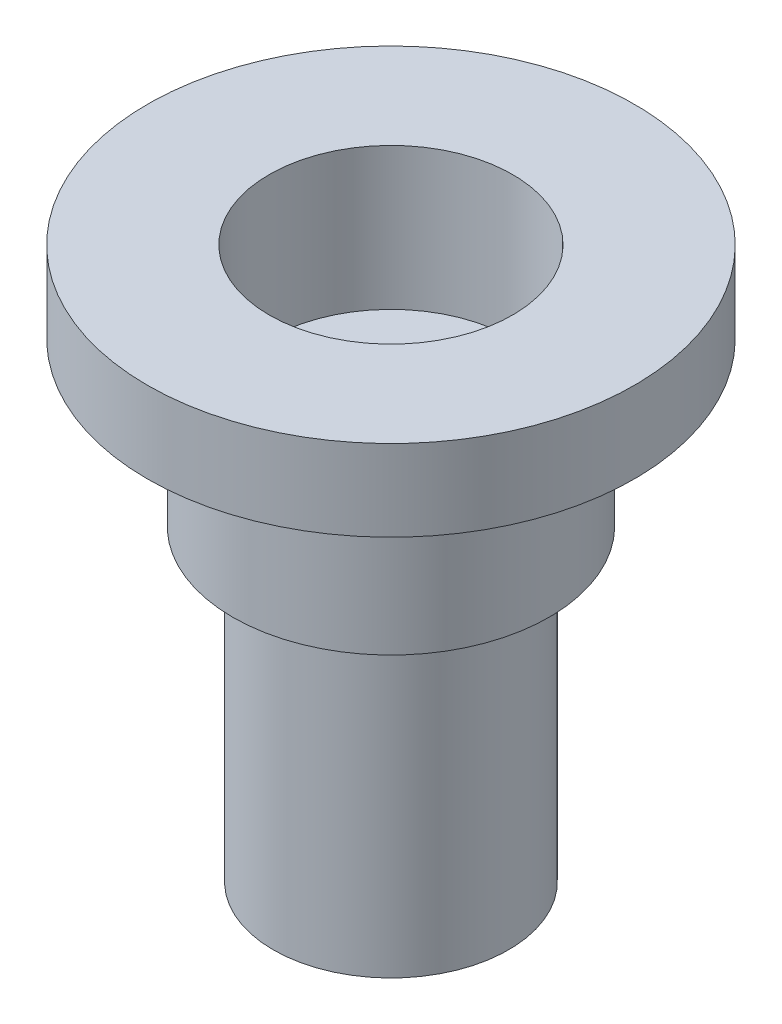
ISO-10303-21;
HEADER;
FILE_DESCRIPTION(('STEP AP214'),'2;1');
FILE_NAME('part.step','',(''),(''),'','','');
FILE_SCHEMA(('AUTOMOTIVE_DESIGN { 1 0 10303 214 1 1 1 1 }'));
ENDSEC;
DATA;
#1=APPLICATION_CONTEXT('core data for automotive mechanical design processes');
#2=APPLICATION_PROTOCOL_DEFINITION('international standard','automotive_design',2000,#1);
#3=PRODUCT_CONTEXT('',#1,'mechanical');
#4=PRODUCT('Part','Part','',(#3));
#5=PRODUCT_RELATED_PRODUCT_CATEGORY('part','',(#4));
#6=PRODUCT_DEFINITION_FORMATION('','',#4);
#7=PRODUCT_DEFINITION_CONTEXT('part definition',#1,'design');
#8=PRODUCT_DEFINITION('design','',#6,#7);
#9=PRODUCT_DEFINITION_SHAPE('','',#8);
#10=(LENGTH_UNIT() NAMED_UNIT(*) SI_UNIT(.MILLI.,.METRE.));
#11=(NAMED_UNIT(*) PLANE_ANGLE_UNIT() SI_UNIT($,.RADIAN.));
#12=(NAMED_UNIT(*) SI_UNIT($,.STERADIAN.) SOLID_ANGLE_UNIT());
#13=UNCERTAINTY_MEASURE_WITH_UNIT(LENGTH_MEASURE(1.E-05),#10,'distance_accuracy_value','');
#14=(GEOMETRIC_REPRESENTATION_CONTEXT(3) GLOBAL_UNCERTAINTY_ASSIGNED_CONTEXT((#13)) GLOBAL_UNIT_ASSIGNED_CONTEXT((#10,
#11,#12)) REPRESENTATION_CONTEXT('',''));
#15=CARTESIAN_POINT('',(0.,0.,0.));
#16=DIRECTION('',(0.,0.,1.));
#17=DIRECTION('',(1.,0.,0.));
#18=AXIS2_PLACEMENT_3D('',#15,#16,#17);
#19=CARTESIAN_POINT('',(0.,-7.6,0.));
#20=DIRECTION('',(0.,1.,0.));
#21=DIRECTION('',(0.,0.,1.));
#22=AXIS2_PLACEMENT_3D('',#19,#20,#21);
#23=CYLINDRICAL_SURFACE('',#22,1.6);
#24=CARTESIAN_POINT('',(0.,-7.6,0.));
#25=DIRECTION('',(0.,1.,0.));
#26=DIRECTION('',(0.,0.,1.));
#27=AXIS2_PLACEMENT_3D('',#24,#25,#26);
#28=CIRCLE('',#27,1.6);
#29=CARTESIAN_POINT('',(0.,-7.6,1.6));
#30=VERTEX_POINT('',#29);
#31=EDGE_CURVE('E207',#30,#30,#28,.T.);
#32=ORIENTED_EDGE('',*,*,#31,.F.);
#33=EDGE_LOOP('',(#32));
#34=FACE_BOUND('',#33,.T.);
#35=CARTESIAN_POINT('',(0.,2.5,0.));
#36=DIRECTION('',(0.,1.,0.));
#37=DIRECTION('',(0.,0.,1.));
#38=AXIS2_PLACEMENT_3D('',#35,#36,#37);
#39=CIRCLE('',#38,1.6);
#40=CARTESIAN_POINT('',(0.,2.5,1.6));
#41=VERTEX_POINT('',#40);
#42=EDGE_CURVE('E45',#41,#41,#39,.F.);
#43=ORIENTED_EDGE('',*,*,#42,.F.);
#44=EDGE_LOOP('',(#43));
#45=FACE_BOUND('',#44,.T.);
#46=ADVANCED_FACE('F41',(#34,#45),#23,.F.);
#47=CARTESIAN_POINT('',(0.,4.,0.));
#48=DIRECTION('',(0.,-1.,0.));
#49=DIRECTION('',(0.,0.,-1.));
#50=AXIS2_PLACEMENT_3D('',#47,#48,#49);
#51=CYLINDRICAL_SURFACE('',#50,3.9);
#52=CARTESIAN_POINT('',(0.,4.,0.));
#53=DIRECTION('',(0.,1.,0.));
#54=DIRECTION('',(0.,0.,1.));
#55=AXIS2_PLACEMENT_3D('',#52,#53,#54);
#56=CIRCLE('',#55,3.9);
#57=CARTESIAN_POINT('',(0.,4.,3.9));
#58=VERTEX_POINT('',#57);
#59=EDGE_CURVE('E50',#58,#58,#56,.T.);
#60=ORIENTED_EDGE('',*,*,#59,.F.);
#61=EDGE_LOOP('',(#60));
#62=FACE_BOUND('',#61,.T.);
#63=CARTESIAN_POINT('',(0.,0.,0.));
#64=DIRECTION('',(0.,1.,0.));
#65=DIRECTION('',(0.,0.,1.));
#66=AXIS2_PLACEMENT_3D('',#63,#64,#65);
#67=CIRCLE('',#66,3.9);
#68=CARTESIAN_POINT('',(0.,0.,3.9));
#69=VERTEX_POINT('',#68);
#70=EDGE_CURVE('E56',#69,#69,#67,.T.);
#71=ORIENTED_EDGE('',*,*,#70,.T.);
#72=EDGE_LOOP('',(#71));
#73=FACE_BOUND('',#72,.T.);
#74=ADVANCED_FACE('F43',(#62,#73),#51,.T.);
#75=CARTESIAN_POINT('',(0.,0.,0.));
#76=DIRECTION('',(0.,1.,0.));
#77=DIRECTION('',(0.,0.,1.));
#78=AXIS2_PLACEMENT_3D('',#75,#76,#77);
#79=PLANE('',#78);
#80=CARTESIAN_POINT('',(0.,0.,0.));
#81=DIRECTION('',(0.,-1.,0.));
#82=DIRECTION('',(0.,0.,-1.));
#83=AXIS2_PLACEMENT_3D('',#80,#81,#82);
#84=CIRCLE('',#83,2.9);
#85=CARTESIAN_POINT('',(0.,0.,2.9));
#86=VERTEX_POINT('',#85);
#87=EDGE_CURVE('E10',#86,#86,#84,.T.);
#88=ORIENTED_EDGE('',*,*,#87,.F.);
#89=EDGE_LOOP('',(#88));
#90=FACE_BOUND('',#89,.T.);
#91=ORIENTED_EDGE('',*,*,#70,.F.);
#92=EDGE_LOOP('',(#91));
#93=FACE_BOUND('',#92,.T.);
#94=ADVANCED_FACE('F74',(#90,#93),#79,.F.);
#95=CARTESIAN_POINT('',(0.,6.,0.));
#96=DIRECTION('',(0.,-1.,0.));
#97=DIRECTION('',(0.,0.,-1.));
#98=AXIS2_PLACEMENT_3D('',#95,#96,#97);
#99=CYLINDRICAL_SURFACE('',#98,6.);
#100=CARTESIAN_POINT('',(0.,6.,0.));
#101=DIRECTION('',(0.,1.,0.));
#102=DIRECTION('',(0.,0.,1.));
#103=AXIS2_PLACEMENT_3D('',#100,#101,#102);
#104=CIRCLE('',#103,6.);
#105=CARTESIAN_POINT('',(0.,6.,6.));
#106=VERTEX_POINT('',#105);
#107=EDGE_CURVE('E62',#106,#106,#104,.T.);
#108=ORIENTED_EDGE('',*,*,#107,.F.);
#109=EDGE_LOOP('',(#108));
#110=FACE_BOUND('',#109,.T.);
#111=CARTESIAN_POINT('',(0.,4.,0.));
#112=DIRECTION('',(0.,1.,0.));
#113=DIRECTION('',(0.,0.,1.));
#114=AXIS2_PLACEMENT_3D('',#111,#112,#113);
#115=CIRCLE('',#114,6.);
#116=CARTESIAN_POINT('',(0.,4.,6.));
#117=VERTEX_POINT('',#116);
#118=EDGE_CURVE('E66',#117,#117,#115,.T.);
#119=ORIENTED_EDGE('',*,*,#118,.T.);
#120=EDGE_LOOP('',(#119));
#121=FACE_BOUND('',#120,.T.);
#122=ADVANCED_FACE('F76',(#110,#121),#99,.T.);
#123=CARTESIAN_POINT('',(0.,6.,0.));
#124=DIRECTION('',(0.,1.,0.));
#125=DIRECTION('',(0.,0.,1.));
#126=AXIS2_PLACEMENT_3D('',#123,#124,#125);
#127=PLANE('',#126);
#128=CARTESIAN_POINT('',(0.,6.,0.));
#129=DIRECTION('',(0.,1.,0.));
#130=DIRECTION('',(0.,0.,1.));
#131=AXIS2_PLACEMENT_3D('',#128,#129,#130);
#132=CIRCLE('',#131,3.);
#133=CARTESIAN_POINT('',(0.,6.,3.));
#134=VERTEX_POINT('',#133);
#135=EDGE_CURVE('E202',#134,#134,#132,.T.);
#136=ORIENTED_EDGE('',*,*,#135,.F.);
#137=EDGE_LOOP('',(#136));
#138=FACE_BOUND('',#137,.T.);
#139=ORIENTED_EDGE('',*,*,#107,.T.);
#140=EDGE_LOOP('',(#139));
#141=FACE_BOUND('',#140,.T.);
#142=ADVANCED_FACE('F82',(#138,#141),#127,.T.);
#143=CARTESIAN_POINT('',(0.,4.,0.));
#144=DIRECTION('',(0.,1.,0.));
#145=DIRECTION('',(0.,0.,1.));
#146=AXIS2_PLACEMENT_3D('',#143,#144,#145);
#147=PLANE('',#146);
#148=ORIENTED_EDGE('',*,*,#59,.T.);
#149=EDGE_LOOP('',(#148));
#150=FACE_BOUND('',#149,.T.);
#151=ORIENTED_EDGE('',*,*,#118,.F.);
#152=EDGE_LOOP('',(#151));
#153=FACE_BOUND('',#152,.T.);
#154=ADVANCED_FACE('F105',(#150,#153),#147,.F.);
#155=CARTESIAN_POINT('',(0.,-7.6,0.));
#156=DIRECTION('',(0.,1.,0.));
#157=DIRECTION('',(0.,0.,1.));
#158=AXIS2_PLACEMENT_3D('',#155,#156,#157);
#159=CYLINDRICAL_SURFACE('',#158,2.9);
#160=CARTESIAN_POINT('',(0.,-7.6,0.));
#161=DIRECTION('',(0.,-1.,0.));
#162=DIRECTION('',(0.,0.,-1.));
#163=AXIS2_PLACEMENT_3D('',#160,#161,#162);
#164=CIRCLE('',#163,2.9);
#165=CARTESIAN_POINT('',(0.,-7.6,2.9));
#166=VERTEX_POINT('',#165);
#167=EDGE_CURVE('E60',#166,#166,#164,.T.);
#168=CARTESIAN_POINT('',(0.,-7.6,2.9));
#169=CARTESIAN_POINT('',(0.,-7.52083333333333,2.9));
#170=CARTESIAN_POINT('',(0.,-7.44166666666667,2.9));
#171=CARTESIAN_POINT('',(0.,-7.28333333333333,2.9));
#172=CARTESIAN_POINT('',(0.,-7.20416666666667,2.9));
#173=CARTESIAN_POINT('',(0.,-7.04583333333333,2.9));
#174=CARTESIAN_POINT('',(0.,-6.96666666666667,2.9));
#175=CARTESIAN_POINT('',(0.,-6.80833333333333,2.9));
#176=CARTESIAN_POINT('',(0.,-6.72916666666667,2.9));
#177=CARTESIAN_POINT('',(0.,-6.57083333333333,2.9));
#178=CARTESIAN_POINT('',(0.,-6.49166666666667,2.9));
#179=CARTESIAN_POINT('',(0.,-6.33333333333333,2.9));
#180=CARTESIAN_POINT('',(0.,-6.25416666666667,2.9));
#181=CARTESIAN_POINT('',(0.,-6.09583333333333,2.9));
#182=CARTESIAN_POINT('',(0.,-6.01666666666667,2.9));
#183=CARTESIAN_POINT('',(0.,-5.85833333333333,2.9));
#184=CARTESIAN_POINT('',(0.,-5.77916666666667,2.9));
#185=CARTESIAN_POINT('',(0.,-5.62083333333333,2.9));
#186=CARTESIAN_POINT('',(0.,-5.54166666666667,2.9));
#187=CARTESIAN_POINT('',(0.,-5.38333333333333,2.9));
#188=CARTESIAN_POINT('',(0.,-5.30416666666667,2.9));
#189=CARTESIAN_POINT('',(0.,-5.14583333333333,2.9));
#190=CARTESIAN_POINT('',(0.,-5.06666666666667,2.9));
#191=CARTESIAN_POINT('',(0.,-4.90833333333333,2.9));
#192=CARTESIAN_POINT('',(0.,-4.82916666666667,2.9));
#193=CARTESIAN_POINT('',(0.,-4.67083333333333,2.9));
#194=CARTESIAN_POINT('',(0.,-4.59166666666667,2.9));
#195=CARTESIAN_POINT('',(0.,-4.43333333333333,2.9));
#196=CARTESIAN_POINT('',(0.,-4.35416666666667,2.9));
#197=CARTESIAN_POINT('',(0.,-4.19583333333333,2.9));
#198=CARTESIAN_POINT('',(0.,-4.11666666666667,2.9));
#199=CARTESIAN_POINT('',(0.,-3.95833333333333,2.9));
#200=CARTESIAN_POINT('',(0.,-3.87916666666667,2.9));
#201=CARTESIAN_POINT('',(0.,-3.72083333333333,2.9));
#202=CARTESIAN_POINT('',(0.,-3.64166666666667,2.9));
#203=CARTESIAN_POINT('',(0.,-3.48333333333333,2.9));
#204=CARTESIAN_POINT('',(0.,-3.40416666666667,2.9));
#205=CARTESIAN_POINT('',(0.,-3.24583333333333,2.9));
#206=CARTESIAN_POINT('',(0.,-3.16666666666667,2.9));
#207=CARTESIAN_POINT('',(0.,-3.00833333333333,2.9));
#208=CARTESIAN_POINT('',(0.,-2.92916666666667,2.9));
#209=CARTESIAN_POINT('',(0.,-2.77083333333333,2.9));
#210=CARTESIAN_POINT('',(0.,-2.69166666666667,2.9));
#211=CARTESIAN_POINT('',(0.,-2.53333333333333,2.9));
#212=CARTESIAN_POINT('',(0.,-2.45416666666667,2.9));
#213=CARTESIAN_POINT('',(0.,-2.29583333333333,2.9));
#214=CARTESIAN_POINT('',(0.,-2.21666666666667,2.9));
#215=CARTESIAN_POINT('',(0.,-2.05833333333333,2.9));
#216=CARTESIAN_POINT('',(0.,-1.97916666666667,2.9));
#217=CARTESIAN_POINT('',(0.,-1.82083333333333,2.9));
#218=CARTESIAN_POINT('',(0.,-1.74166666666667,2.9));
#219=CARTESIAN_POINT('',(0.,-1.58333333333333,2.9));
#220=CARTESIAN_POINT('',(0.,-1.50416666666667,2.9));
#221=CARTESIAN_POINT('',(0.,-1.34583333333333,2.9));
#222=CARTESIAN_POINT('',(0.,-1.26666666666667,2.9));
#223=CARTESIAN_POINT('',(0.,-1.10833333333333,2.9));
#224=CARTESIAN_POINT('',(0.,-1.02916666666667,2.9));
#225=CARTESIAN_POINT('',(0.,-0.870833333333333,2.9));
#226=CARTESIAN_POINT('',(0.,-0.791666666666667,2.9));
#227=CARTESIAN_POINT('',(0.,-0.633333333333333,2.9));
#228=CARTESIAN_POINT('',(0.,-0.554166666666666,2.9));
#229=CARTESIAN_POINT('',(0.,-0.395833333333333,2.9));
#230=CARTESIAN_POINT('',(0.,-0.316666666666667,2.9));
#231=CARTESIAN_POINT('',(0.,-0.158333333333333,2.9));
#232=CARTESIAN_POINT('',(0.,-0.0791666666666665,2.9));
#233=CARTESIAN_POINT('',(0.,0.,2.9));
#234=B_SPLINE_CURVE_WITH_KNOTS('',3,(#168,#169,#170,#171,#172,#173,#174,#175,#176,#177,#178,
#179,#180,#181,#182,#183,#184,#185,#186,#187,#188,#189,#190,#191,#192,#193,#194,#195,#196,#197,
#198,#199,#200,#201,#202,#203,#204,#205,#206,#207,#208,#209,#210,#211,#212,#213,#214,#215,#216,
#217,#218,#219,#220,#221,#222,#223,#224,#225,#226,#227,#228,#229,#230,#231,#232,#233),
.UNSPECIFIED.,.F.,.F.,(4,2,2,2,2,2,2,2,2,2,2,2,2,2,2,2,2,2,2,2,2,2,2,2,2,2,2,2,2,2,2,2,4),(0.,
0.2375,0.475,0.7125,0.95,1.1875,1.425,1.6625,1.9,2.1375,2.375,2.6125,2.85,3.0875,3.325,3.5625,
3.8,4.0375,4.275,4.5125,4.75,4.9875,5.225,5.4625,5.7,5.9375,6.175,6.4125,6.65,6.8875,7.125,
7.3625,7.6),.UNSPECIFIED.);
#235=EDGE_CURVE('BSEAM101',#166,#86,#234,.T.);
#236=ORIENTED_EDGE('',*,*,#167,.F.);
#237=ORIENTED_EDGE('',*,*,#87,.T.);
#238=ORIENTED_EDGE('',*,*,#235,.T.);
#239=ORIENTED_EDGE('',*,*,#235,.F.);
#240=EDGE_LOOP('',(#236,#238,#237,#239));
#241=FACE_BOUND('',#240,.T.);
#242=ADVANCED_FACE('F101',(#241),#159,.T.);
#243=CARTESIAN_POINT('',(0.,-7.6,0.));
#244=DIRECTION('',(0.,-1.,0.));
#245=DIRECTION('',(0.,0.,-1.));
#246=AXIS2_PLACEMENT_3D('',#243,#244,#245);
#247=PLANE('',#246);
#248=ORIENTED_EDGE('',*,*,#31,.T.);
#249=EDGE_LOOP('',(#248));
#250=FACE_BOUND('',#249,.T.);
#251=ORIENTED_EDGE('',*,*,#167,.T.);
#252=EDGE_LOOP('',(#251));
#253=FACE_BOUND('',#252,.T.);
#254=ADVANCED_FACE('F97',(#250,#253),#247,.T.);
#255=CARTESIAN_POINT('',(0.,2.5,0.));
#256=DIRECTION('',(0.,1.,0.));
#257=DIRECTION('',(0.,0.,1.));
#258=AXIS2_PLACEMENT_3D('',#255,#256,#257);
#259=PLANE('',#258);
#260=CARTESIAN_POINT('',(0.,2.5,0.));
#261=DIRECTION('',(0.,1.,0.));
#262=DIRECTION('',(0.,0.,1.));
#263=AXIS2_PLACEMENT_3D('',#260,#261,#262);
#264=CIRCLE('',#263,3.);
#265=CARTESIAN_POINT('',(0.,2.5,3.));
#266=VERTEX_POINT('',#265);
#267=EDGE_CURVE('E199',#266,#266,#264,.T.);
#268=ORIENTED_EDGE('',*,*,#267,.T.);
#269=EDGE_LOOP('',(#268));
#270=FACE_BOUND('',#269,.T.);
#271=ORIENTED_EDGE('',*,*,#42,.T.);
#272=EDGE_LOOP('',(#271));
#273=FACE_BOUND('',#272,.T.);
#274=ADVANCED_FACE('F100',(#270,#273),#259,.T.);
#275=CARTESIAN_POINT('',(0.,2.5,0.));
#276=DIRECTION('',(0.,1.,0.));
#277=DIRECTION('',(0.,0.,1.));
#278=AXIS2_PLACEMENT_3D('',#275,#276,#277);
#279=CYLINDRICAL_SURFACE('',#278,3.);
#280=ORIENTED_EDGE('',*,*,#267,.F.);
#281=EDGE_LOOP('',(#280));
#282=FACE_BOUND('',#281,.T.);
#283=ORIENTED_EDGE('',*,*,#135,.T.);
#284=EDGE_LOOP('',(#283));
#285=FACE_BOUND('',#284,.T.);
#286=ADVANCED_FACE('F95',(#282,#285),#279,.F.);
#287=CLOSED_SHELL('',(#46,#74,#94,#122,#142,#154,#242,#254,#274,#286));
#288=MANIFOLD_SOLID_BREP('B2',#287);
#289=ADVANCED_BREP_SHAPE_REPRESENTATION('',(#18,#288),#14);
#290=SHAPE_DEFINITION_REPRESENTATION(#9,#289);
ENDSEC;
END-ISO-10303-21;
